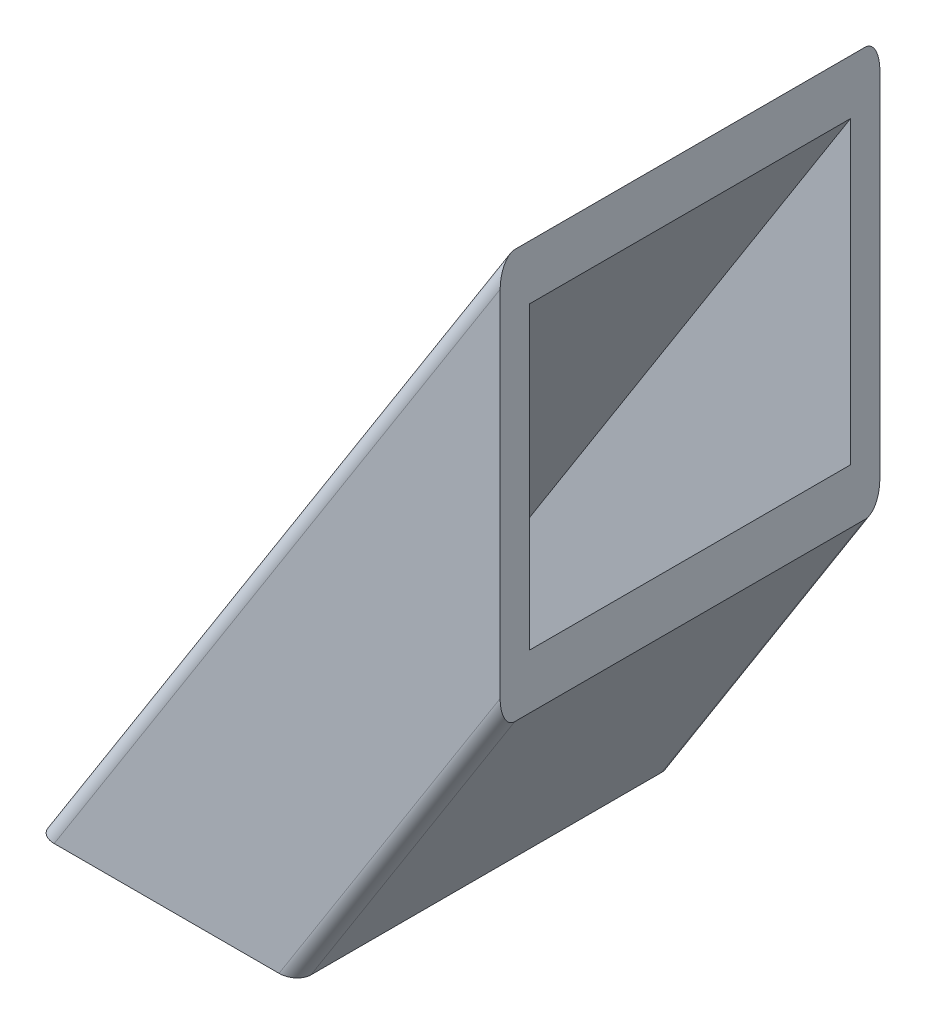
ISO-10303-21;
HEADER;
FILE_DESCRIPTION(('STEP AP214'),'2;1');
FILE_NAME('part.step','',(''),(''),'','','');
FILE_SCHEMA(('AUTOMOTIVE_DESIGN { 1 0 10303 214 1 1 1 1 }'));
ENDSEC;
DATA;
#1=APPLICATION_CONTEXT('core data for automotive mechanical design processes');
#2=APPLICATION_PROTOCOL_DEFINITION('international standard','automotive_design',2000,#1);
#3=PRODUCT_CONTEXT('',#1,'mechanical');
#4=PRODUCT('Part','Part','',(#3));
#5=PRODUCT_RELATED_PRODUCT_CATEGORY('part','',(#4));
#6=PRODUCT_DEFINITION_FORMATION('','',#4);
#7=PRODUCT_DEFINITION_CONTEXT('part definition',#1,'design');
#8=PRODUCT_DEFINITION('design','',#6,#7);
#9=PRODUCT_DEFINITION_SHAPE('','',#8);
#10=(LENGTH_UNIT() NAMED_UNIT(*) SI_UNIT(.MILLI.,.METRE.));
#11=(NAMED_UNIT(*) PLANE_ANGLE_UNIT() SI_UNIT($,.RADIAN.));
#12=(NAMED_UNIT(*) SI_UNIT($,.STERADIAN.) SOLID_ANGLE_UNIT());
#13=UNCERTAINTY_MEASURE_WITH_UNIT(LENGTH_MEASURE(1.E-05),#10,'distance_accuracy_value','');
#14=(GEOMETRIC_REPRESENTATION_CONTEXT(3) GLOBAL_UNCERTAINTY_ASSIGNED_CONTEXT((#13)) GLOBAL_UNIT_ASSIGNED_CONTEXT((#10,
#11,#12)) REPRESENTATION_CONTEXT('',''));
#15=CARTESIAN_POINT('',(0.,0.,0.));
#16=DIRECTION('',(0.,0.,1.));
#17=DIRECTION('',(1.,0.,0.));
#18=AXIS2_PLACEMENT_3D('',#15,#16,#17);
#19=CARTESIAN_POINT('',(13.9575128364479,50.,26.));
#20=DIRECTION('',(-1.,0.,0.));
#21=DIRECTION('',(0.,0.,1.));
#22=AXIS2_PLACEMENT_3D('',#19,#20,#21);
#23=PLANE('',#22);
#24=DIRECTION('',(0.,0.,-1.));
#25=VECTOR('',#24,1.);
#26=CARTESIAN_POINT('',(13.9575128364479,22.,26.));
#27=LINE('',#26,#25);
#28=CARTESIAN_POINT('',(13.9575128364479,22.,25.));
#29=VERTEX_POINT('',#28);
#30=CARTESIAN_POINT('',(13.9575128364479,22.,1.00000000000001));
#31=VERTEX_POINT('',#30);
#32=EDGE_CURVE('E244',#29,#31,#27,.T.);
#33=ORIENTED_EDGE('',*,*,#32,.T.);
#34=CARTESIAN_POINT('',(13.9575128364479,23.8666666666667,1.));
#35=DIRECTION('',(-1.,0.,0.));
#36=DIRECTION('',(0.,1.,0.));
#37=AXIS2_PLACEMENT_3D('',#34,#35,#36);
#38=ELLIPSE('',#37,1.86666666666667,1.);
#39=CARTESIAN_POINT('',(13.9575128364479,23.8666666666667,0.));
#40=VERTEX_POINT('',#39);
#41=EDGE_CURVE('E264',#31,#40,#38,.F.);
#42=ORIENTED_EDGE('',*,*,#41,.T.);
#43=DIRECTION('',(0.,1.,0.));
#44=VECTOR('',#43,1.);
#45=CARTESIAN_POINT('',(13.9575128364479,50.,0.));
#46=LINE('',#45,#44);
#47=CARTESIAN_POINT('',(13.9575128364479,48.1333333333333,0.));
#48=VERTEX_POINT('',#47);
#49=EDGE_CURVE('E209',#40,#48,#46,.T.);
#50=ORIENTED_EDGE('',*,*,#49,.T.);
#51=CARTESIAN_POINT('',(13.9575128364479,48.1333333333333,1.));
#52=DIRECTION('',(-1.,0.,0.));
#53=DIRECTION('',(0.,-1.,0.));
#54=AXIS2_PLACEMENT_3D('',#51,#52,#53);
#55=ELLIPSE('',#54,1.86666666666667,1.);
#56=CARTESIAN_POINT('',(13.9575128364479,50.,1.00000000000001));
#57=VERTEX_POINT('',#56);
#58=EDGE_CURVE('E261',#48,#57,#55,.F.);
#59=ORIENTED_EDGE('',*,*,#58,.T.);
#60=DIRECTION('',(0.,0.,-1.));
#61=VECTOR('',#60,1.);
#62=CARTESIAN_POINT('',(13.9575128364479,50.,26.));
#63=LINE('',#62,#61);
#64=CARTESIAN_POINT('',(13.9575128364479,50.,25.));
#65=VERTEX_POINT('',#64);
#66=EDGE_CURVE('E240',#65,#57,#63,.T.);
#67=ORIENTED_EDGE('',*,*,#66,.F.);
#68=CARTESIAN_POINT('',(13.9575128364479,48.1333333333333,25.));
#69=DIRECTION('',(-1.,0.,0.));
#70=DIRECTION('',(0.,1.,0.));
#71=AXIS2_PLACEMENT_3D('',#68,#69,#70);
#72=ELLIPSE('',#71,1.86666666666667,1.);
#73=CARTESIAN_POINT('',(13.9575128364479,48.1333333333333,26.));
#74=VERTEX_POINT('',#73);
#75=EDGE_CURVE('E255',#65,#74,#72,.F.);
#76=ORIENTED_EDGE('',*,*,#75,.T.);
#77=DIRECTION('',(0.,1.,0.));
#78=VECTOR('',#77,1.);
#79=CARTESIAN_POINT('',(13.9575128364479,50.,26.));
#80=LINE('',#79,#78);
#81=CARTESIAN_POINT('',(13.9575128364479,23.8666666666667,26.));
#82=VERTEX_POINT('',#81);
#83=EDGE_CURVE('E218',#82,#74,#80,.T.);
#84=ORIENTED_EDGE('',*,*,#83,.F.);
#85=CARTESIAN_POINT('',(13.9575128364479,23.8666666666667,25.));
#86=DIRECTION('',(-1.,0.,0.));
#87=DIRECTION('',(0.,-1.,0.));
#88=AXIS2_PLACEMENT_3D('',#85,#86,#87);
#89=ELLIPSE('',#88,1.86666666666667,1.);
#90=EDGE_CURVE('E258',#82,#29,#89,.F.);
#91=ORIENTED_EDGE('',*,*,#90,.T.);
#92=EDGE_LOOP('',(#33,#42,#50,#59,#67,#76,#84,#91));
#93=FACE_BOUND('',#92,.T.);
#94=DIRECTION('',(0.,1.,0.));
#95=VECTOR('',#94,1.);
#96=CARTESIAN_POINT('',(13.9575128364479,50.,2.));
#97=LINE('',#96,#95);
#98=CARTESIAN_POINT('',(13.9575128364479,25.7333333333333,2.));
#99=VERTEX_POINT('',#98);
#100=CARTESIAN_POINT('',(13.9575128364479,46.2666666666667,2.));
#101=VERTEX_POINT('',#100);
#102=EDGE_CURVE('E187',#99,#101,#97,.T.);
#103=ORIENTED_EDGE('',*,*,#102,.F.);
#104=DIRECTION('',(0.,0.,-1.));
#105=VECTOR('',#104,1.);
#106=CARTESIAN_POINT('',(13.9575128364479,25.7333333333333,26.));
#107=LINE('',#106,#105);
#108=CARTESIAN_POINT('',(13.9575128364479,25.7333333333333,24.));
#109=VERTEX_POINT('',#108);
#110=EDGE_CURVE('E206',#109,#99,#107,.T.);
#111=ORIENTED_EDGE('',*,*,#110,.F.);
#112=DIRECTION('',(0.,1.,0.));
#113=VECTOR('',#112,1.);
#114=CARTESIAN_POINT('',(13.9575128364479,50.,24.));
#115=LINE('',#114,#113);
#116=CARTESIAN_POINT('',(13.9575128364479,46.2666666666667,24.));
#117=VERTEX_POINT('',#116);
#118=EDGE_CURVE('E191',#109,#117,#115,.T.);
#119=ORIENTED_EDGE('',*,*,#118,.T.);
#120=DIRECTION('',(0.,0.,-1.));
#121=VECTOR('',#120,1.);
#122=CARTESIAN_POINT('',(13.9575128364479,46.2666666666667,26.));
#123=LINE('',#122,#121);
#124=EDGE_CURVE('E200',#117,#101,#123,.T.);
#125=ORIENTED_EDGE('',*,*,#124,.T.);
#126=EDGE_LOOP('',(#103,#111,#119,#125));
#127=FACE_BOUND('',#126,.T.);
#128=ADVANCED_FACE('F39',(#93,#127),#23,.F.);
#129=CARTESIAN_POINT('',(0.,0.,26.));
#130=DIRECTION('',(-0.844399315538349,0.535714285714286,0.));
#131=DIRECTION('',(-0.535714285714286,-0.844399315538349,0.));
#132=AXIS2_PLACEMENT_3D('',#129,#130,#131);
#133=PLANE('',#132);
#134=DIRECTION('',(0.,0.,-1.));
#135=VECTOR('',#134,1.);
#136=CARTESIAN_POINT('',(0.,0.,26.));
#137=LINE('',#136,#135);
#138=CARTESIAN_POINT('',(0.,0.,25.));
#139=VERTEX_POINT('',#138);
#140=CARTESIAN_POINT('',(0.,0.,1.00000000000001));
#141=VERTEX_POINT('',#140);
#142=EDGE_CURVE('E227',#139,#141,#137,.T.);
#143=ORIENTED_EDGE('',*,*,#142,.T.);
#144=DIRECTION('',(0.535714285714286,0.844399315538349,0.));
#145=VECTOR('',#144,1.);
#146=CARTESIAN_POINT('',(0.,0.,1.));
#147=LINE('',#146,#145);
#148=EDGE_CURVE('E251',#141,#31,#147,.T.);
#149=ORIENTED_EDGE('',*,*,#148,.T.);
#150=ORIENTED_EDGE('',*,*,#32,.F.);
#151=DIRECTION('',(0.535714285714286,0.844399315538349,0.));
#152=VECTOR('',#151,1.);
#153=CARTESIAN_POINT('',(0.,0.,25.));
#154=LINE('',#153,#152);
#155=EDGE_CURVE('E248',#29,#139,#154,.F.);
#156=ORIENTED_EDGE('',*,*,#155,.T.);
#157=EDGE_LOOP('',(#143,#149,#150,#156));
#158=FACE_BOUND('',#157,.T.);
#159=ADVANCED_FACE('F321',(#158),#133,.F.);
#160=CARTESIAN_POINT('',(-17.7641072463882,0.,26.));
#161=DIRECTION('',(0.844399315538349,-0.535714285714286,0.));
#162=DIRECTION('',(0.535714285714286,0.844399315538349,0.));
#163=AXIS2_PLACEMENT_3D('',#160,#161,#162);
#164=PLANE('',#163);
#165=ORIENTED_EDGE('',*,*,#66,.T.);
#166=DIRECTION('',(-0.535714285714286,-0.844399315538349,0.));
#167=VECTOR('',#166,1.);
#168=CARTESIAN_POINT('',(-17.7641072463882,0.,1.));
#169=LINE('',#168,#167);
#170=CARTESIAN_POINT('',(-17.7641072463882,0.,1.00000000000001));
#171=VERTEX_POINT('',#170);
#172=EDGE_CURVE('E286',#57,#171,#169,.T.);
#173=ORIENTED_EDGE('',*,*,#172,.T.);
#174=DIRECTION('',(0.,0.,-1.));
#175=VECTOR('',#174,1.);
#176=CARTESIAN_POINT('',(-17.7641072463882,0.,26.));
#177=LINE('',#176,#175);
#178=CARTESIAN_POINT('',(-17.7641072463882,0.,25.));
#179=VERTEX_POINT('',#178);
#180=EDGE_CURVE('E237',#179,#171,#177,.T.);
#181=ORIENTED_EDGE('',*,*,#180,.F.);
#182=DIRECTION('',(-0.535714285714286,-0.844399315538349,0.));
#183=VECTOR('',#182,1.);
#184=CARTESIAN_POINT('',(13.9575128364479,50.,25.));
#185=LINE('',#184,#183);
#186=EDGE_CURVE('E283',#179,#65,#185,.F.);
#187=ORIENTED_EDGE('',*,*,#186,.T.);
#188=EDGE_LOOP('',(#165,#173,#181,#187));
#189=FACE_BOUND('',#188,.T.);
#190=ADVANCED_FACE('F308',(#189),#164,.F.);
#191=CARTESIAN_POINT('',(0.,0.,26.));
#192=DIRECTION('',(0.,1.,0.));
#193=DIRECTION('',(-1.,0.,0.));
#194=AXIS2_PLACEMENT_3D('',#191,#192,#193);
#195=PLANE('',#194);
#196=DIRECTION('',(0.,0.,1.));
#197=VECTOR('',#196,1.);
#198=CARTESIAN_POINT('',(-1.09968282953832,0.,2.));
#199=LINE('',#198,#197);
#200=CARTESIAN_POINT('',(-1.09968282953832,0.,2.));
#201=VERTEX_POINT('',#200);
#202=CARTESIAN_POINT('',(-1.09968282953832,0.,24.));
#203=VERTEX_POINT('',#202);
#204=EDGE_CURVE('E170',#201,#203,#199,.T.);
#205=ORIENTED_EDGE('',*,*,#204,.F.);
#206=DIRECTION('',(1.,0.,0.));
#207=VECTOR('',#206,1.);
#208=CARTESIAN_POINT('',(-14.126694810223,0.,2.));
#209=LINE('',#208,#207);
#210=CARTESIAN_POINT('',(-14.126694810223,0.,2.));
#211=VERTEX_POINT('',#210);
#212=EDGE_CURVE('E148',#211,#201,#209,.T.);
#213=ORIENTED_EDGE('',*,*,#212,.F.);
#214=DIRECTION('',(0.,0.,-1.));
#215=VECTOR('',#214,1.);
#216=CARTESIAN_POINT('',(-14.126694810223,0.,24.));
#217=LINE('',#216,#215);
#218=CARTESIAN_POINT('',(-14.126694810223,0.,24.));
#219=VERTEX_POINT('',#218);
#220=EDGE_CURVE('E160',#219,#211,#217,.T.);
#221=ORIENTED_EDGE('',*,*,#220,.F.);
#222=DIRECTION('',(-1.,0.,0.));
#223=VECTOR('',#222,1.);
#224=CARTESIAN_POINT('',(-1.09968282953832,0.,24.));
#225=LINE('',#224,#223);
#226=EDGE_CURVE('E174',#203,#219,#225,.T.);
#227=ORIENTED_EDGE('',*,*,#226,.F.);
#228=EDGE_LOOP('',(#205,#213,#221,#227));
#229=FACE_BOUND('',#228,.T.);
#230=DIRECTION('',(1.,0.,0.));
#231=VECTOR('',#230,1.);
#232=CARTESIAN_POINT('',(0.,0.,0.));
#233=LINE('',#232,#231);
#234=CARTESIAN_POINT('',(-16.5798334299623,0.,0.));
#235=VERTEX_POINT('',#234);
#236=CARTESIAN_POINT('',(-1.18427381642588,0.,0.));
#237=VERTEX_POINT('',#236);
#238=EDGE_CURVE('E223',#235,#237,#233,.T.);
#239=ORIENTED_EDGE('',*,*,#238,.T.);
#240=CARTESIAN_POINT('',(-1.18427381642588,0.,1.));
#241=DIRECTION('',(0.,1.,0.));
#242=DIRECTION('',(1.,0.,0.));
#243=AXIS2_PLACEMENT_3D('',#240,#241,#242);
#244=ELLIPSE('',#243,1.18427381642588,1.);
#245=EDGE_CURVE('E280',#237,#141,#244,.F.);
#246=ORIENTED_EDGE('',*,*,#245,.T.);
#247=ORIENTED_EDGE('',*,*,#142,.F.);
#248=CARTESIAN_POINT('',(-1.18427381642588,0.,25.));
#249=DIRECTION('',(0.,1.,0.));
#250=DIRECTION('',(-1.,0.,0.));
#251=AXIS2_PLACEMENT_3D('',#248,#249,#250);
#252=ELLIPSE('',#251,1.18427381642588,1.);
#253=CARTESIAN_POINT('',(-1.18427381642588,0.,26.));
#254=VERTEX_POINT('',#253);
#255=EDGE_CURVE('E275',#139,#254,#252,.F.);
#256=ORIENTED_EDGE('',*,*,#255,.T.);
#257=DIRECTION('',(1.,0.,0.));
#258=VECTOR('',#257,1.);
#259=CARTESIAN_POINT('',(0.,0.,26.));
#260=LINE('',#259,#258);
#261=CARTESIAN_POINT('',(-16.5798334299623,0.,26.));
#262=VERTEX_POINT('',#261);
#263=EDGE_CURVE('E222',#262,#254,#260,.T.);
#264=ORIENTED_EDGE('',*,*,#263,.F.);
#265=CARTESIAN_POINT('',(-16.5798334299623,0.,25.));
#266=DIRECTION('',(0.,1.,0.));
#267=DIRECTION('',(1.,0.,0.));
#268=AXIS2_PLACEMENT_3D('',#265,#266,#267);
#269=ELLIPSE('',#268,1.18427381642588,1.);
#270=EDGE_CURVE('E63',#262,#179,#269,.F.);
#271=ORIENTED_EDGE('',*,*,#270,.T.);
#272=ORIENTED_EDGE('',*,*,#180,.T.);
#273=CARTESIAN_POINT('',(-16.5798334299623,0.,1.));
#274=DIRECTION('',(0.,1.,0.));
#275=DIRECTION('',(-1.,0.,0.));
#276=AXIS2_PLACEMENT_3D('',#273,#274,#275);
#277=ELLIPSE('',#276,1.18427381642588,1.);
#278=EDGE_CURVE('E55',#171,#235,#277,.F.);
#279=ORIENTED_EDGE('',*,*,#278,.T.);
#280=EDGE_LOOP('',(#239,#246,#247,#256,#264,#271,#272,#279));
#281=FACE_BOUND('',#280,.T.);
#282=ADVANCED_FACE('F168',(#229,#281),#195,.F.);
#283=CARTESIAN_POINT('',(0.,0.,26.));
#284=DIRECTION('',(0.,0.,1.));
#285=DIRECTION('',(1.,0.,0.));
#286=AXIS2_PLACEMENT_3D('',#283,#284,#285);
#287=PLANE('',#286);
#288=ORIENTED_EDGE('',*,*,#263,.T.);
#289=DIRECTION('',(0.535714285714286,0.844399315538349,0.));
#290=VECTOR('',#289,1.);
#291=CARTESIAN_POINT('',(13.1131135209095,22.5357142857143,26.));
#292=LINE('',#291,#290);
#293=EDGE_CURVE('E11',#254,#82,#292,.T.);
#294=ORIENTED_EDGE('',*,*,#293,.T.);
#295=ORIENTED_EDGE('',*,*,#83,.T.);
#296=DIRECTION('',(-0.535714285714286,-0.844399315538349,0.));
#297=VECTOR('',#296,1.);
#298=CARTESIAN_POINT('',(-16.9197079308498,-0.535714285714285,26.));
#299=LINE('',#298,#297);
#300=EDGE_CURVE('E48',#74,#262,#299,.T.);
#301=ORIENTED_EDGE('',*,*,#300,.T.);
#302=EDGE_LOOP('',(#288,#294,#295,#301));
#303=FACE_BOUND('',#302,.T.);
#304=ADVANCED_FACE('F292',(#303),#287,.T.);
#305=CARTESIAN_POINT('',(0.,0.,0.));
#306=DIRECTION('',(0.,0.,1.));
#307=DIRECTION('',(1.,0.,0.));
#308=AXIS2_PLACEMENT_3D('',#305,#306,#307);
#309=PLANE('',#308);
#310=ORIENTED_EDGE('',*,*,#49,.F.);
#311=DIRECTION('',(0.535714285714286,0.844399315538349,0.));
#312=VECTOR('',#311,1.);
#313=CARTESIAN_POINT('',(-0.844399315538349,0.535714285714286,0.));
#314=LINE('',#313,#312);
#315=EDGE_CURVE('E270',#40,#237,#314,.F.);
#316=ORIENTED_EDGE('',*,*,#315,.T.);
#317=ORIENTED_EDGE('',*,*,#238,.F.);
#318=DIRECTION('',(-0.535714285714286,-0.844399315538349,0.));
#319=VECTOR('',#318,1.);
#320=CARTESIAN_POINT('',(-11.8215904175369,7.50000000000001,0.));
#321=LINE('',#320,#319);
#322=EDGE_CURVE('E267',#235,#48,#321,.F.);
#323=ORIENTED_EDGE('',*,*,#322,.T.);
#324=EDGE_LOOP('',(#310,#316,#317,#323));
#325=FACE_BOUND('',#324,.T.);
#326=ADVANCED_FACE('F313',(#325),#309,.F.);
#327=CARTESIAN_POINT('',(-1.6887986310767,1.07142857142857,26.));
#328=DIRECTION('',(-0.844399315538349,0.535714285714286,0.));
#329=DIRECTION('',(-0.535714285714286,-0.844399315538349,0.));
#330=AXIS2_PLACEMENT_3D('',#327,#328,#329);
#331=PLANE('',#330);
#332=DIRECTION('',(0.535714285714286,0.844399315538349,0.));
#333=VECTOR('',#332,1.);
#334=CARTESIAN_POINT('',(-1.6887986310767,1.07142857142857,2.));
#335=LINE('',#334,#333);
#336=CARTESIAN_POINT('',(-1.09968282953832,2.,2.));
#337=VERTEX_POINT('',#336);
#338=EDGE_CURVE('E165',#337,#99,#335,.T.);
#339=ORIENTED_EDGE('',*,*,#338,.F.);
#340=DIRECTION('',(0.,0.,-1.));
#341=VECTOR('',#340,1.);
#342=CARTESIAN_POINT('',(-1.09968282953832,2.,26.));
#343=LINE('',#342,#341);
#344=CARTESIAN_POINT('',(-1.09968282953832,2.,24.));
#345=VERTEX_POINT('',#344);
#346=EDGE_CURVE('E192',#345,#337,#343,.T.);
#347=ORIENTED_EDGE('',*,*,#346,.F.);
#348=DIRECTION('',(0.535714285714286,0.844399315538349,0.));
#349=VECTOR('',#348,1.);
#350=CARTESIAN_POINT('',(-1.6887986310767,1.07142857142857,24.));
#351=LINE('',#350,#349);
#352=EDGE_CURVE('E188',#345,#109,#351,.T.);
#353=ORIENTED_EDGE('',*,*,#352,.T.);
#354=ORIENTED_EDGE('',*,*,#110,.T.);
#355=EDGE_LOOP('',(#339,#347,#353,#354));
#356=FACE_BOUND('',#355,.T.);
#357=ADVANCED_FACE('F367',(#356),#331,.T.);
#358=CARTESIAN_POINT('',(-16.0753086153115,-1.07142857142857,26.));
#359=DIRECTION('',(0.844399315538349,-0.535714285714286,0.));
#360=DIRECTION('',(0.535714285714286,0.844399315538349,0.));
#361=AXIS2_PLACEMENT_3D('',#358,#359,#360);
#362=PLANE('',#361);
#363=DIRECTION('',(-0.535714285714286,-0.844399315538349,0.));
#364=VECTOR('',#363,1.);
#365=CARTESIAN_POINT('',(-16.0753086153115,-1.07142857142857,2.));
#366=LINE('',#365,#364);
#367=CARTESIAN_POINT('',(-14.126694810223,2.,2.));
#368=VERTEX_POINT('',#367);
#369=EDGE_CURVE('E151',#101,#368,#366,.T.);
#370=ORIENTED_EDGE('',*,*,#369,.F.);
#371=ORIENTED_EDGE('',*,*,#124,.F.);
#372=DIRECTION('',(-0.535714285714286,-0.844399315538349,0.));
#373=VECTOR('',#372,1.);
#374=CARTESIAN_POINT('',(-16.0753086153115,-1.07142857142857,24.));
#375=LINE('',#374,#373);
#376=CARTESIAN_POINT('',(-14.126694810223,2.,24.));
#377=VERTEX_POINT('',#376);
#378=EDGE_CURVE('E197',#117,#377,#375,.T.);
#379=ORIENTED_EDGE('',*,*,#378,.T.);
#380=DIRECTION('',(0.,0.,-1.));
#381=VECTOR('',#380,1.);
#382=CARTESIAN_POINT('',(-14.126694810223,2.,26.));
#383=LINE('',#382,#381);
#384=EDGE_CURVE('E196',#377,#368,#383,.T.);
#385=ORIENTED_EDGE('',*,*,#384,.T.);
#386=EDGE_LOOP('',(#370,#371,#379,#385));
#387=FACE_BOUND('',#386,.T.);
#388=ADVANCED_FACE('F436',(#387),#362,.T.);
#389=CARTESIAN_POINT('',(0.,0.,24.));
#390=DIRECTION('',(0.,0.,1.));
#391=DIRECTION('',(1.,0.,0.));
#392=AXIS2_PLACEMENT_3D('',#389,#390,#391);
#393=PLANE('',#392);
#394=ORIENTED_EDGE('',*,*,#352,.F.);
#395=DIRECTION('',(0.,1.,0.));
#396=VECTOR('',#395,1.);
#397=CARTESIAN_POINT('',(-1.09968282953832,-0.00100000000000013,24.));
#398=LINE('',#397,#396);
#399=EDGE_CURVE('E180',#203,#345,#398,.T.);
#400=ORIENTED_EDGE('',*,*,#399,.F.);
#401=ORIENTED_EDGE('',*,*,#226,.T.);
#402=DIRECTION('',(0.,1.,0.));
#403=VECTOR('',#402,1.);
#404=CARTESIAN_POINT('',(-14.126694810223,-0.00100000000000013,24.));
#405=LINE('',#404,#403);
#406=EDGE_CURVE('E156',#219,#377,#405,.T.);
#407=ORIENTED_EDGE('',*,*,#406,.T.);
#408=ORIENTED_EDGE('',*,*,#378,.F.);
#409=ORIENTED_EDGE('',*,*,#118,.F.);
#410=EDGE_LOOP('',(#394,#400,#401,#407,#408,#409));
#411=FACE_BOUND('',#410,.T.);
#412=ADVANCED_FACE('F426',(#411),#393,.F.);
#413=CARTESIAN_POINT('',(0.,0.,2.));
#414=DIRECTION('',(0.,0.,1.));
#415=DIRECTION('',(1.,0.,0.));
#416=AXIS2_PLACEMENT_3D('',#413,#414,#415);
#417=PLANE('',#416);
#418=ORIENTED_EDGE('',*,*,#338,.T.);
#419=ORIENTED_EDGE('',*,*,#102,.T.);
#420=ORIENTED_EDGE('',*,*,#369,.T.);
#421=DIRECTION('',(0.,1.,0.));
#422=VECTOR('',#421,1.);
#423=CARTESIAN_POINT('',(-14.126694810223,-0.00100000000000013,2.));
#424=LINE('',#423,#422);
#425=EDGE_CURVE('E143',#211,#368,#424,.T.);
#426=ORIENTED_EDGE('',*,*,#425,.F.);
#427=ORIENTED_EDGE('',*,*,#212,.T.);
#428=DIRECTION('',(0.,1.,0.));
#429=VECTOR('',#428,1.);
#430=CARTESIAN_POINT('',(-1.09968282953832,-0.00100000000000013,2.));
#431=LINE('',#430,#429);
#432=EDGE_CURVE('E166',#201,#337,#431,.T.);
#433=ORIENTED_EDGE('',*,*,#432,.T.);
#434=EDGE_LOOP('',(#418,#419,#420,#426,#427,#433));
#435=FACE_BOUND('',#434,.T.);
#436=ADVANCED_FACE('F146',(#435),#417,.T.);
#437=CARTESIAN_POINT('',(-1.09968282953832,-0.00100000000000013,2.));
#438=DIRECTION('',(1.,0.,0.));
#439=DIRECTION('',(0.,1.,0.));
#440=AXIS2_PLACEMENT_3D('',#437,#438,#439);
#441=PLANE('',#440);
#442=ORIENTED_EDGE('',*,*,#204,.T.);
#443=ORIENTED_EDGE('',*,*,#399,.T.);
#444=ORIENTED_EDGE('',*,*,#346,.T.);
#445=ORIENTED_EDGE('',*,*,#432,.F.);
#446=EDGE_LOOP('',(#442,#443,#444,#445));
#447=FACE_BOUND('',#446,.T.);
#448=ADVANCED_FACE('F408',(#447),#441,.F.);
#449=CARTESIAN_POINT('',(-14.126694810223,-0.00100000000000013,24.));
#450=DIRECTION('',(-1.,0.,0.));
#451=DIRECTION('',(0.,-1.,0.));
#452=AXIS2_PLACEMENT_3D('',#449,#450,#451);
#453=PLANE('',#452);
#454=ORIENTED_EDGE('',*,*,#220,.T.);
#455=ORIENTED_EDGE('',*,*,#425,.T.);
#456=ORIENTED_EDGE('',*,*,#384,.F.);
#457=ORIENTED_EDGE('',*,*,#406,.F.);
#458=EDGE_LOOP('',(#454,#455,#456,#457));
#459=FACE_BOUND('',#458,.T.);
#460=ADVANCED_FACE('F161',(#459),#453,.F.);
#461=CARTESIAN_POINT('',(-0.844399315538349,0.535714285714286,1.));
#462=DIRECTION('',(0.535714285714286,0.844399315538349,0.));
#463=DIRECTION('',(-0.844399315538349,0.535714285714286,0.));
#464=AXIS2_PLACEMENT_3D('',#461,#462,#463);
#465=CYLINDRICAL_SURFACE('',#464,1.);
#466=ORIENTED_EDGE('',*,*,#245,.F.);
#467=ORIENTED_EDGE('',*,*,#315,.F.);
#468=ORIENTED_EDGE('',*,*,#41,.F.);
#469=ORIENTED_EDGE('',*,*,#148,.F.);
#470=EDGE_LOOP('',(#466,#467,#468,#469));
#471=FACE_BOUND('',#470,.T.);
#472=ADVANCED_FACE('F318',(#471),#465,.T.);
#473=CARTESIAN_POINT('',(-16.9197079308498,-0.535714285714286,1.));
#474=DIRECTION('',(-0.535714285714286,-0.844399315538349,0.));
#475=DIRECTION('',(0.844399315538349,-0.535714285714286,0.));
#476=AXIS2_PLACEMENT_3D('',#473,#474,#475);
#477=CYLINDRICAL_SURFACE('',#476,1.);
#478=ORIENTED_EDGE('',*,*,#58,.F.);
#479=ORIENTED_EDGE('',*,*,#322,.F.);
#480=ORIENTED_EDGE('',*,*,#278,.F.);
#481=ORIENTED_EDGE('',*,*,#172,.F.);
#482=EDGE_LOOP('',(#478,#479,#480,#481));
#483=FACE_BOUND('',#482,.T.);
#484=ADVANCED_FACE('F316',(#483),#477,.T.);
#485=CARTESIAN_POINT('',(-0.844399315538349,0.535714285714286,25.));
#486=DIRECTION('',(-0.535714285714286,-0.844399315538349,0.));
#487=DIRECTION('',(0.844399315538349,-0.535714285714286,0.));
#488=AXIS2_PLACEMENT_3D('',#485,#486,#487);
#489=CYLINDRICAL_SURFACE('',#488,1.);
#490=ORIENTED_EDGE('',*,*,#255,.F.);
#491=ORIENTED_EDGE('',*,*,#155,.F.);
#492=ORIENTED_EDGE('',*,*,#90,.F.);
#493=ORIENTED_EDGE('',*,*,#293,.F.);
#494=EDGE_LOOP('',(#490,#491,#492,#493));
#495=FACE_BOUND('',#494,.T.);
#496=ADVANCED_FACE('F301',(#495),#489,.T.);
#497=CARTESIAN_POINT('',(-11.8215904175369,7.50000000000001,25.));
#498=DIRECTION('',(0.535714285714286,0.844399315538349,0.));
#499=DIRECTION('',(-0.844399315538349,0.535714285714286,0.));
#500=AXIS2_PLACEMENT_3D('',#497,#498,#499);
#501=CYLINDRICAL_SURFACE('',#500,1.);
#502=ORIENTED_EDGE('',*,*,#75,.F.);
#503=ORIENTED_EDGE('',*,*,#186,.F.);
#504=ORIENTED_EDGE('',*,*,#270,.F.);
#505=ORIENTED_EDGE('',*,*,#300,.F.);
#506=EDGE_LOOP('',(#502,#503,#504,#505));
#507=FACE_BOUND('',#506,.T.);
#508=ADVANCED_FACE('F41',(#507),#501,.T.);
#509=CLOSED_SHELL('',(#128,#159,#190,#282,#304,#326,#357,#388,#412,#436,#448,#460,#472,#484,
#496,#508));
#510=MANIFOLD_SOLID_BREP('B2',#509);
#511=ADVANCED_BREP_SHAPE_REPRESENTATION('',(#18,#510),#14);
#512=SHAPE_DEFINITION_REPRESENTATION(#9,#511);
ENDSEC;
END-ISO-10303-21;
